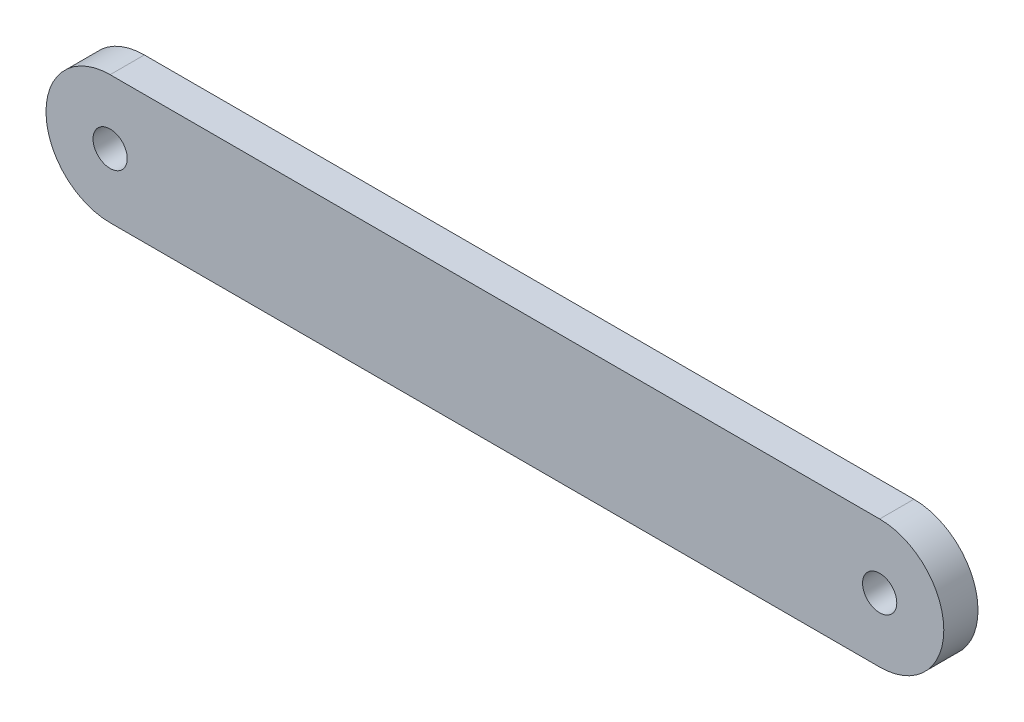
ISO-10303-21;
HEADER;
FILE_DESCRIPTION(('STEP AP214'),'2;1');
FILE_NAME('part.step','',(''),(''),'','','');
FILE_SCHEMA(('AUTOMOTIVE_DESIGN { 1 0 10303 214 1 1 1 1 }'));
ENDSEC;
DATA;
#1=APPLICATION_CONTEXT('core data for automotive mechanical design processes');
#2=APPLICATION_PROTOCOL_DEFINITION('international standard','automotive_design',2000,#1);
#3=PRODUCT_CONTEXT('',#1,'mechanical');
#4=PRODUCT('Part','Part','',(#3));
#5=PRODUCT_RELATED_PRODUCT_CATEGORY('part','',(#4));
#6=PRODUCT_DEFINITION_FORMATION('','',#4);
#7=PRODUCT_DEFINITION_CONTEXT('part definition',#1,'design');
#8=PRODUCT_DEFINITION('design','',#6,#7);
#9=PRODUCT_DEFINITION_SHAPE('','',#8);
#10=(LENGTH_UNIT() NAMED_UNIT(*) SI_UNIT(.MILLI.,.METRE.));
#11=(NAMED_UNIT(*) PLANE_ANGLE_UNIT() SI_UNIT($,.RADIAN.));
#12=(NAMED_UNIT(*) SI_UNIT($,.STERADIAN.) SOLID_ANGLE_UNIT());
#13=UNCERTAINTY_MEASURE_WITH_UNIT(LENGTH_MEASURE(1.E-05),#10,'distance_accuracy_value','');
#14=(GEOMETRIC_REPRESENTATION_CONTEXT(3) GLOBAL_UNCERTAINTY_ASSIGNED_CONTEXT((#13)) GLOBAL_UNIT_ASSIGNED_CONTEXT((#10,
#11,#12)) REPRESENTATION_CONTEXT('',''));
#15=CARTESIAN_POINT('',(0.,0.,0.));
#16=DIRECTION('',(0.,0.,1.));
#17=DIRECTION('',(1.,0.,0.));
#18=AXIS2_PLACEMENT_3D('',#15,#16,#17);
#19=CARTESIAN_POINT('',(0.,-7.5,4.));
#20=DIRECTION('',(0.,1.,0.));
#21=DIRECTION('',(0.,0.,1.));
#22=AXIS2_PLACEMENT_3D('',#19,#20,#21);
#23=PLANE('',#22);
#24=DIRECTION('',(1.,0.,0.));
#25=VECTOR('',#24,1.);
#26=CARTESIAN_POINT('',(0.,-7.5,0.));
#27=LINE('',#26,#25);
#28=CARTESIAN_POINT('',(0.,-7.5,0.));
#29=VERTEX_POINT('',#28);
#30=CARTESIAN_POINT('',(90.,-7.5,0.));
#31=VERTEX_POINT('',#30);
#32=EDGE_CURVE('E106',#29,#31,#27,.T.);
#33=ORIENTED_EDGE('',*,*,#32,.T.);
#34=DIRECTION('',(0.,0.,-1.));
#35=VECTOR('',#34,1.);
#36=CARTESIAN_POINT('',(90.,-7.5,4.));
#37=LINE('',#36,#35);
#38=CARTESIAN_POINT('',(90.,-7.5,4.));
#39=VERTEX_POINT('',#38);
#40=EDGE_CURVE('E11',#39,#31,#37,.T.);
#41=ORIENTED_EDGE('',*,*,#40,.F.);
#42=DIRECTION('',(1.,0.,0.));
#43=VECTOR('',#42,1.);
#44=CARTESIAN_POINT('',(0.,-7.5,4.));
#45=LINE('',#44,#43);
#46=CARTESIAN_POINT('',(0.,-7.5,4.));
#47=VERTEX_POINT('',#46);
#48=EDGE_CURVE('E85',#47,#39,#45,.T.);
#49=ORIENTED_EDGE('',*,*,#48,.F.);
#50=DIRECTION('',(0.,0.,-1.));
#51=VECTOR('',#50,1.);
#52=CARTESIAN_POINT('',(0.,-7.5,4.));
#53=LINE('',#52,#51);
#54=EDGE_CURVE('E96',#47,#29,#53,.T.);
#55=ORIENTED_EDGE('',*,*,#54,.T.);
#56=EDGE_LOOP('',(#33,#41,#49,#55));
#57=FACE_BOUND('',#56,.T.);
#58=ADVANCED_FACE('F37',(#57),#23,.F.);
#59=CARTESIAN_POINT('',(90.,0.,4.));
#60=DIRECTION('',(0.,0.,-1.));
#61=DIRECTION('',(-1.,0.,0.));
#62=AXIS2_PLACEMENT_3D('',#59,#60,#61);
#63=CYLINDRICAL_SURFACE('',#62,7.5);
#64=CARTESIAN_POINT('',(90.,0.,0.));
#65=DIRECTION('',(0.,0.,1.));
#66=DIRECTION('',(1.,0.,0.));
#67=AXIS2_PLACEMENT_3D('',#64,#65,#66);
#68=CIRCLE('',#67,7.5);
#69=CARTESIAN_POINT('',(90.,7.5,0.));
#70=VERTEX_POINT('',#69);
#71=EDGE_CURVE('E90',#31,#70,#68,.T.);
#72=ORIENTED_EDGE('',*,*,#71,.T.);
#73=DIRECTION('',(0.,0.,-1.));
#74=VECTOR('',#73,1.);
#75=CARTESIAN_POINT('',(90.,7.5,4.));
#76=LINE('',#75,#74);
#77=CARTESIAN_POINT('',(90.,7.5,4.));
#78=VERTEX_POINT('',#77);
#79=EDGE_CURVE('E46',#78,#70,#76,.T.);
#80=ORIENTED_EDGE('',*,*,#79,.F.);
#81=CARTESIAN_POINT('',(90.,0.,4.));
#82=DIRECTION('',(0.,0.,1.));
#83=DIRECTION('',(1.,0.,0.));
#84=AXIS2_PLACEMENT_3D('',#81,#82,#83);
#85=CIRCLE('',#84,7.5);
#86=EDGE_CURVE('E80',#39,#78,#85,.T.);
#87=ORIENTED_EDGE('',*,*,#86,.F.);
#88=ORIENTED_EDGE('',*,*,#40,.T.);
#89=EDGE_LOOP('',(#72,#80,#87,#88));
#90=FACE_BOUND('',#89,.T.);
#91=ADVANCED_FACE('F89',(#90),#63,.T.);
#92=CARTESIAN_POINT('',(0.,7.5,4.));
#93=DIRECTION('',(0.,1.,0.));
#94=DIRECTION('',(0.,0.,1.));
#95=AXIS2_PLACEMENT_3D('',#92,#93,#94);
#96=PLANE('',#95);
#97=DIRECTION('',(1.,0.,0.));
#98=VECTOR('',#97,1.);
#99=CARTESIAN_POINT('',(0.,7.5,0.));
#100=LINE('',#99,#98);
#101=CARTESIAN_POINT('',(0.,7.5,0.));
#102=VERTEX_POINT('',#101);
#103=EDGE_CURVE('E110',#102,#70,#100,.T.);
#104=ORIENTED_EDGE('',*,*,#103,.F.);
#105=DIRECTION('',(0.,0.,-1.));
#106=VECTOR('',#105,1.);
#107=CARTESIAN_POINT('',(0.,7.5,4.));
#108=LINE('',#107,#106);
#109=CARTESIAN_POINT('',(0.,7.5,4.));
#110=VERTEX_POINT('',#109);
#111=EDGE_CURVE('E70',#110,#102,#108,.T.);
#112=ORIENTED_EDGE('',*,*,#111,.F.);
#113=DIRECTION('',(1.,0.,0.));
#114=VECTOR('',#113,1.);
#115=CARTESIAN_POINT('',(0.,7.5,4.));
#116=LINE('',#115,#114);
#117=EDGE_CURVE('E83',#110,#78,#116,.T.);
#118=ORIENTED_EDGE('',*,*,#117,.T.);
#119=ORIENTED_EDGE('',*,*,#79,.T.);
#120=EDGE_LOOP('',(#104,#112,#118,#119));
#121=FACE_BOUND('',#120,.T.);
#122=ADVANCED_FACE('F94',(#121),#96,.T.);
#123=CARTESIAN_POINT('',(0.,0.,4.));
#124=DIRECTION('',(0.,0.,-1.));
#125=DIRECTION('',(-1.,0.,0.));
#126=AXIS2_PLACEMENT_3D('',#123,#124,#125);
#127=CYLINDRICAL_SURFACE('',#126,2.);
#128=CARTESIAN_POINT('',(0.,0.,4.));
#129=DIRECTION('',(0.,0.,1.));
#130=DIRECTION('',(1.,0.,0.));
#131=AXIS2_PLACEMENT_3D('',#128,#129,#130);
#132=CIRCLE('',#131,2.);
#133=CARTESIAN_POINT('',(2.,0.,4.));
#134=VERTEX_POINT('',#133);
#135=EDGE_CURVE('E148',#134,#134,#132,.T.);
#136=ORIENTED_EDGE('',*,*,#135,.T.);
#137=EDGE_LOOP('',(#136));
#138=FACE_BOUND('',#137,.T.);
#139=CARTESIAN_POINT('',(0.,0.,0.));
#140=DIRECTION('',(0.,0.,1.));
#141=DIRECTION('',(1.,0.,0.));
#142=AXIS2_PLACEMENT_3D('',#139,#140,#141);
#143=CIRCLE('',#142,2.);
#144=CARTESIAN_POINT('',(2.,0.,0.));
#145=VERTEX_POINT('',#144);
#146=EDGE_CURVE('E103',#145,#145,#143,.T.);
#147=ORIENTED_EDGE('',*,*,#146,.F.);
#148=EDGE_LOOP('',(#147));
#149=FACE_BOUND('',#148,.T.);
#150=ADVANCED_FACE('F137',(#138,#149),#127,.F.);
#151=CARTESIAN_POINT('',(90.,0.,4.));
#152=DIRECTION('',(0.,0.,-1.));
#153=DIRECTION('',(-1.,0.,0.));
#154=AXIS2_PLACEMENT_3D('',#151,#152,#153);
#155=CYLINDRICAL_SURFACE('',#154,2.);
#156=CARTESIAN_POINT('',(90.,0.,4.));
#157=DIRECTION('',(0.,0.,1.));
#158=DIRECTION('',(1.,0.,0.));
#159=AXIS2_PLACEMENT_3D('',#156,#157,#158);
#160=CIRCLE('',#159,2.);
#161=CARTESIAN_POINT('',(92.,0.,4.));
#162=VERTEX_POINT('',#161);
#163=EDGE_CURVE('E113',#162,#162,#160,.T.);
#164=ORIENTED_EDGE('',*,*,#163,.T.);
#165=EDGE_LOOP('',(#164));
#166=FACE_BOUND('',#165,.T.);
#167=CARTESIAN_POINT('',(90.,0.,0.));
#168=DIRECTION('',(0.,0.,1.));
#169=DIRECTION('',(1.,0.,0.));
#170=AXIS2_PLACEMENT_3D('',#167,#168,#169);
#171=CIRCLE('',#170,2.);
#172=CARTESIAN_POINT('',(92.,0.,0.));
#173=VERTEX_POINT('',#172);
#174=EDGE_CURVE('E100',#173,#173,#171,.T.);
#175=ORIENTED_EDGE('',*,*,#174,.F.);
#176=EDGE_LOOP('',(#175));
#177=FACE_BOUND('',#176,.T.);
#178=ADVANCED_FACE('F39',(#166,#177),#155,.F.);
#179=CARTESIAN_POINT('',(0.,0.,4.));
#180=DIRECTION('',(0.,0.,-1.));
#181=DIRECTION('',(-1.,0.,0.));
#182=AXIS2_PLACEMENT_3D('',#179,#180,#181);
#183=CYLINDRICAL_SURFACE('',#182,7.5);
#184=CARTESIAN_POINT('',(0.,0.,0.));
#185=DIRECTION('',(0.,0.,1.));
#186=DIRECTION('',(1.,0.,0.));
#187=AXIS2_PLACEMENT_3D('',#184,#185,#186);
#188=CIRCLE('',#187,7.5);
#189=EDGE_CURVE('E73',#102,#29,#188,.T.);
#190=ORIENTED_EDGE('',*,*,#189,.T.);
#191=ORIENTED_EDGE('',*,*,#54,.F.);
#192=CARTESIAN_POINT('',(0.,0.,4.));
#193=DIRECTION('',(0.,0.,1.));
#194=DIRECTION('',(1.,0.,0.));
#195=AXIS2_PLACEMENT_3D('',#192,#193,#194);
#196=CIRCLE('',#195,7.5);
#197=EDGE_CURVE('E54',#110,#47,#196,.T.);
#198=ORIENTED_EDGE('',*,*,#197,.F.);
#199=ORIENTED_EDGE('',*,*,#111,.T.);
#200=EDGE_LOOP('',(#190,#191,#198,#199));
#201=FACE_BOUND('',#200,.T.);
#202=ADVANCED_FACE('F125',(#201),#183,.T.);
#203=CARTESIAN_POINT('',(0.,0.,4.));
#204=DIRECTION('',(0.,0.,1.));
#205=DIRECTION('',(1.,0.,0.));
#206=AXIS2_PLACEMENT_3D('',#203,#204,#205);
#207=PLANE('',#206);
#208=ORIENTED_EDGE('',*,*,#163,.F.);
#209=EDGE_LOOP('',(#208));
#210=FACE_BOUND('',#209,.T.);
#211=ORIENTED_EDGE('',*,*,#135,.F.);
#212=EDGE_LOOP('',(#211));
#213=FACE_BOUND('',#212,.T.);
#214=ORIENTED_EDGE('',*,*,#48,.T.);
#215=ORIENTED_EDGE('',*,*,#86,.T.);
#216=ORIENTED_EDGE('',*,*,#117,.F.);
#217=ORIENTED_EDGE('',*,*,#197,.T.);
#218=EDGE_LOOP('',(#214,#215,#216,#217));
#219=FACE_BOUND('',#218,.T.);
#220=ADVANCED_FACE('F81',(#210,#213,#219),#207,.T.);
#221=CARTESIAN_POINT('',(0.,0.,0.));
#222=DIRECTION('',(0.,0.,1.));
#223=DIRECTION('',(1.,0.,0.));
#224=AXIS2_PLACEMENT_3D('',#221,#222,#223);
#225=PLANE('',#224);
#226=ORIENTED_EDGE('',*,*,#174,.T.);
#227=EDGE_LOOP('',(#226));
#228=FACE_BOUND('',#227,.T.);
#229=ORIENTED_EDGE('',*,*,#146,.T.);
#230=EDGE_LOOP('',(#229));
#231=FACE_BOUND('',#230,.T.);
#232=ORIENTED_EDGE('',*,*,#32,.F.);
#233=ORIENTED_EDGE('',*,*,#189,.F.);
#234=ORIENTED_EDGE('',*,*,#103,.T.);
#235=ORIENTED_EDGE('',*,*,#71,.F.);
#236=EDGE_LOOP('',(#232,#233,#234,#235));
#237=FACE_BOUND('',#236,.T.);
#238=ADVANCED_FACE('F118',(#228,#231,#237),#225,.F.);
#239=CLOSED_SHELL('',(#58,#91,#122,#150,#178,#202,#220,#238));
#240=MANIFOLD_SOLID_BREP('B2',#239);
#241=ADVANCED_BREP_SHAPE_REPRESENTATION('',(#18,#240),#14);
#242=SHAPE_DEFINITION_REPRESENTATION(#9,#241);
ENDSEC;
END-ISO-10303-21;
